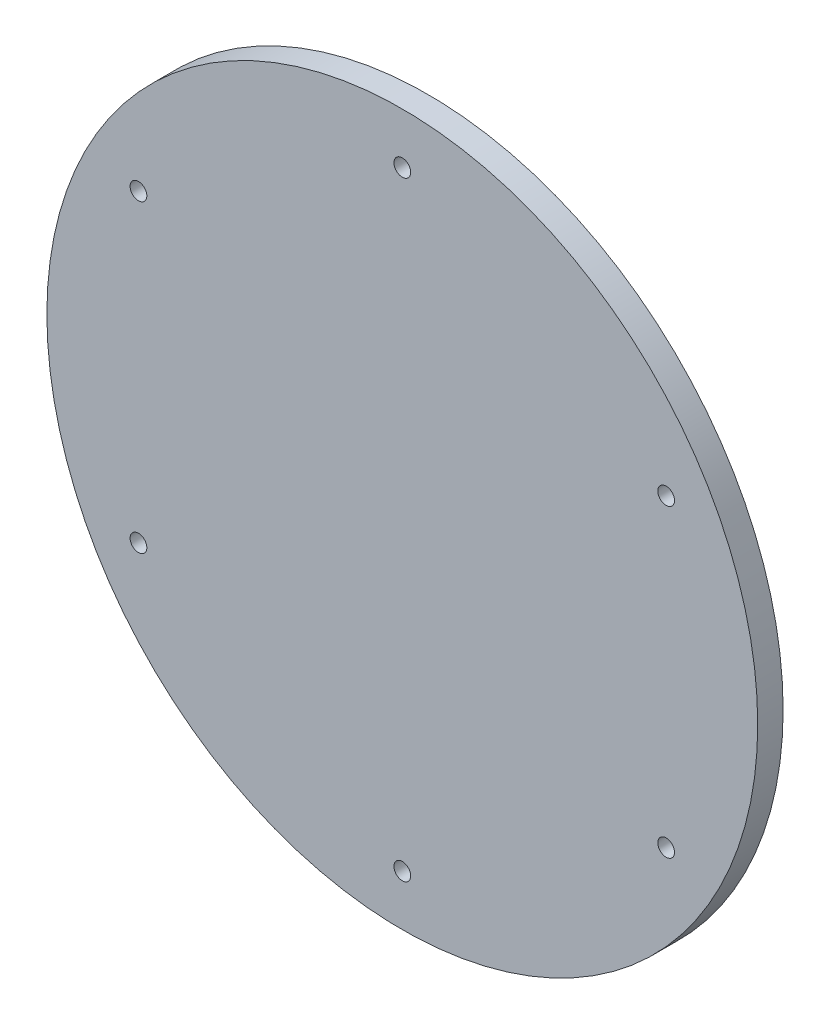
ISO-10303-21;
HEADER;
FILE_DESCRIPTION(('STEP AP214'),'2;1');
FILE_NAME('part.step','',(''),(''),'','','');
FILE_SCHEMA(('AUTOMOTIVE_DESIGN { 1 0 10303 214 1 1 1 1 }'));
ENDSEC;
DATA;
#1=APPLICATION_CONTEXT('core data for automotive mechanical design processes');
#2=APPLICATION_PROTOCOL_DEFINITION('international standard','automotive_design',2000,#1);
#3=PRODUCT_CONTEXT('',#1,'mechanical');
#4=PRODUCT('Part','Part','',(#3));
#5=PRODUCT_RELATED_PRODUCT_CATEGORY('part','',(#4));
#6=PRODUCT_DEFINITION_FORMATION('','',#4);
#7=PRODUCT_DEFINITION_CONTEXT('part definition',#1,'design');
#8=PRODUCT_DEFINITION('design','',#6,#7);
#9=PRODUCT_DEFINITION_SHAPE('','',#8);
#10=(LENGTH_UNIT() NAMED_UNIT(*) SI_UNIT(.MILLI.,.METRE.));
#11=(NAMED_UNIT(*) PLANE_ANGLE_UNIT() SI_UNIT($,.RADIAN.));
#12=(NAMED_UNIT(*) SI_UNIT($,.STERADIAN.) SOLID_ANGLE_UNIT());
#13=UNCERTAINTY_MEASURE_WITH_UNIT(LENGTH_MEASURE(1.E-05),#10,'distance_accuracy_value','');
#14=(GEOMETRIC_REPRESENTATION_CONTEXT(3) GLOBAL_UNCERTAINTY_ASSIGNED_CONTEXT((#13)) GLOBAL_UNIT_ASSIGNED_CONTEXT((#10,
#11,#12)) REPRESENTATION_CONTEXT('',''));
#15=CARTESIAN_POINT('',(0.,0.,0.));
#16=DIRECTION('',(0.,0.,1.));
#17=DIRECTION('',(1.,0.,0.));
#18=AXIS2_PLACEMENT_3D('',#15,#16,#17);
#19=CARTESIAN_POINT('',(0.,0.,5.));
#20=DIRECTION('',(0.,0.,1.));
#21=DIRECTION('',(1.,0.,0.));
#22=AXIS2_PLACEMENT_3D('',#19,#20,#21);
#23=PLANE('',#22);
#24=CARTESIAN_POINT('',(-51.9615242270663,-30.,5.));
#25=DIRECTION('',(0.,0.,1.));
#26=DIRECTION('',(1.,0.,0.));
#27=AXIS2_PLACEMENT_3D('',#24,#25,#26);
#28=CIRCLE('',#27,1.65);
#29=CARTESIAN_POINT('',(-50.3115242270663,-30.,5.));
#30=VERTEX_POINT('',#29);
#31=EDGE_CURVE('E65',#30,#30,#28,.T.);
#32=ORIENTED_EDGE('',*,*,#31,.F.);
#33=EDGE_LOOP('',(#32));
#34=FACE_BOUND('',#33,.T.);
#35=CARTESIAN_POINT('',(51.9615242270663,-30.,5.));
#36=DIRECTION('',(0.,0.,1.));
#37=DIRECTION('',(1.,0.,0.));
#38=AXIS2_PLACEMENT_3D('',#35,#36,#37);
#39=CIRCLE('',#38,1.65000000000015);
#40=CARTESIAN_POINT('',(53.6115242270665,-30.,5.));
#41=VERTEX_POINT('',#40);
#42=EDGE_CURVE('E53',#41,#41,#39,.T.);
#43=ORIENTED_EDGE('',*,*,#42,.F.);
#44=EDGE_LOOP('',(#43));
#45=FACE_BOUND('',#44,.T.);
#46=CARTESIAN_POINT('',(0.,60.,5.));
#47=DIRECTION('',(0.,0.,1.));
#48=DIRECTION('',(1.,0.,0.));
#49=AXIS2_PLACEMENT_3D('',#46,#47,#48);
#50=CIRCLE('',#49,1.65);
#51=CARTESIAN_POINT('',(1.65,60.,5.));
#52=VERTEX_POINT('',#51);
#53=EDGE_CURVE('E42',#52,#52,#50,.T.);
#54=ORIENTED_EDGE('',*,*,#53,.F.);
#55=EDGE_LOOP('',(#54));
#56=FACE_BOUND('',#55,.T.);
#57=CARTESIAN_POINT('',(0.,0.,5.));
#58=DIRECTION('',(0.,0.,1.));
#59=DIRECTION('',(1.,0.,0.));
#60=AXIS2_PLACEMENT_3D('',#57,#58,#59);
#61=CIRCLE('',#60,70.);
#62=CARTESIAN_POINT('',(70.,0.,5.));
#63=VERTEX_POINT('',#62);
#64=EDGE_CURVE('E10',#63,#63,#61,.T.);
#65=ORIENTED_EDGE('',*,*,#64,.T.);
#66=EDGE_LOOP('',(#65));
#67=FACE_BOUND('',#66,.T.);
#68=CARTESIAN_POINT('',(51.9615242270663,30.,5.));
#69=DIRECTION('',(0.,0.,1.));
#70=DIRECTION('',(1.,0.,0.));
#71=AXIS2_PLACEMENT_3D('',#68,#69,#70);
#72=CIRCLE('',#71,1.65000000000008);
#73=CARTESIAN_POINT('',(53.6115242270664,30.,5.));
#74=VERTEX_POINT('',#73);
#75=EDGE_CURVE('E47',#74,#74,#72,.T.);
#76=ORIENTED_EDGE('',*,*,#75,.F.);
#77=EDGE_LOOP('',(#76));
#78=FACE_BOUND('',#77,.T.);
#79=CARTESIAN_POINT('',(0.,-60.,5.));
#80=DIRECTION('',(0.,0.,1.));
#81=DIRECTION('',(1.,0.,0.));
#82=AXIS2_PLACEMENT_3D('',#79,#80,#81);
#83=CIRCLE('',#82,1.65);
#84=CARTESIAN_POINT('',(1.65000000000001,-60.,5.));
#85=VERTEX_POINT('',#84);
#86=EDGE_CURVE('E59',#85,#85,#83,.T.);
#87=ORIENTED_EDGE('',*,*,#86,.F.);
#88=EDGE_LOOP('',(#87));
#89=FACE_BOUND('',#88,.T.);
#90=CARTESIAN_POINT('',(-51.9615242270663,30.,5.));
#91=DIRECTION('',(0.,0.,1.));
#92=DIRECTION('',(1.,0.,0.));
#93=AXIS2_PLACEMENT_3D('',#90,#91,#92);
#94=CIRCLE('',#93,1.65);
#95=CARTESIAN_POINT('',(-50.3115242270664,30.,5.));
#96=VERTEX_POINT('',#95);
#97=EDGE_CURVE('E71',#96,#96,#94,.T.);
#98=ORIENTED_EDGE('',*,*,#97,.F.);
#99=EDGE_LOOP('',(#98));
#100=FACE_BOUND('',#99,.T.);
#101=ADVANCED_FACE('F31',(#34,#45,#56,#67,#78,#89,#100),#23,.T.);
#102=CARTESIAN_POINT('',(0.,0.,0.));
#103=DIRECTION('',(0.,0.,1.));
#104=DIRECTION('',(1.,0.,0.));
#105=AXIS2_PLACEMENT_3D('',#102,#103,#104);
#106=PLANE('',#105);
#107=CARTESIAN_POINT('',(0.,0.,0.));
#108=DIRECTION('',(0.,0.,1.));
#109=DIRECTION('',(1.,0.,0.));
#110=AXIS2_PLACEMENT_3D('',#107,#108,#109);
#111=CIRCLE('',#110,70.);
#112=CARTESIAN_POINT('',(70.,0.,0.));
#113=VERTEX_POINT('',#112);
#114=EDGE_CURVE('E35',#113,#113,#111,.T.);
#115=ORIENTED_EDGE('',*,*,#114,.F.);
#116=EDGE_LOOP('',(#115));
#117=FACE_BOUND('',#116,.T.);
#118=CARTESIAN_POINT('',(0.,60.,0.));
#119=DIRECTION('',(0.,0.,1.));
#120=DIRECTION('',(1.,0.,0.));
#121=AXIS2_PLACEMENT_3D('',#118,#119,#120);
#122=CIRCLE('',#121,1.65);
#123=CARTESIAN_POINT('',(1.65,60.,0.));
#124=VERTEX_POINT('',#123);
#125=EDGE_CURVE('E44',#124,#124,#122,.T.);
#126=ORIENTED_EDGE('',*,*,#125,.T.);
#127=EDGE_LOOP('',(#126));
#128=FACE_BOUND('',#127,.T.);
#129=CARTESIAN_POINT('',(51.9615242270663,30.,0.));
#130=DIRECTION('',(0.,0.,1.));
#131=DIRECTION('',(1.,0.,0.));
#132=AXIS2_PLACEMENT_3D('',#129,#130,#131);
#133=CIRCLE('',#132,1.65000000000008);
#134=CARTESIAN_POINT('',(53.6115242270664,30.,0.));
#135=VERTEX_POINT('',#134);
#136=EDGE_CURVE('E50',#135,#135,#133,.T.);
#137=ORIENTED_EDGE('',*,*,#136,.T.);
#138=EDGE_LOOP('',(#137));
#139=FACE_BOUND('',#138,.T.);
#140=CARTESIAN_POINT('',(51.9615242270663,-30.,0.));
#141=DIRECTION('',(0.,0.,1.));
#142=DIRECTION('',(1.,0.,0.));
#143=AXIS2_PLACEMENT_3D('',#140,#141,#142);
#144=CIRCLE('',#143,1.65000000000015);
#145=CARTESIAN_POINT('',(53.6115242270665,-30.,0.));
#146=VERTEX_POINT('',#145);
#147=EDGE_CURVE('E56',#146,#146,#144,.T.);
#148=ORIENTED_EDGE('',*,*,#147,.T.);
#149=EDGE_LOOP('',(#148));
#150=FACE_BOUND('',#149,.T.);
#151=CARTESIAN_POINT('',(0.,-60.,0.));
#152=DIRECTION('',(0.,0.,1.));
#153=DIRECTION('',(1.,0.,0.));
#154=AXIS2_PLACEMENT_3D('',#151,#152,#153);
#155=CIRCLE('',#154,1.65);
#156=CARTESIAN_POINT('',(1.65000000000001,-60.,0.));
#157=VERTEX_POINT('',#156);
#158=EDGE_CURVE('E62',#157,#157,#155,.T.);
#159=ORIENTED_EDGE('',*,*,#158,.T.);
#160=EDGE_LOOP('',(#159));
#161=FACE_BOUND('',#160,.T.);
#162=CARTESIAN_POINT('',(-51.9615242270663,-30.,0.));
#163=DIRECTION('',(0.,0.,1.));
#164=DIRECTION('',(1.,0.,0.));
#165=AXIS2_PLACEMENT_3D('',#162,#163,#164);
#166=CIRCLE('',#165,1.65);
#167=CARTESIAN_POINT('',(-50.3115242270663,-30.,0.));
#168=VERTEX_POINT('',#167);
#169=EDGE_CURVE('E68',#168,#168,#166,.T.);
#170=ORIENTED_EDGE('',*,*,#169,.T.);
#171=EDGE_LOOP('',(#170));
#172=FACE_BOUND('',#171,.T.);
#173=CARTESIAN_POINT('',(-51.9615242270663,30.,0.));
#174=DIRECTION('',(0.,0.,1.));
#175=DIRECTION('',(1.,0.,0.));
#176=AXIS2_PLACEMENT_3D('',#173,#174,#175);
#177=CIRCLE('',#176,1.65);
#178=CARTESIAN_POINT('',(-50.3115242270664,30.,0.));
#179=VERTEX_POINT('',#178);
#180=EDGE_CURVE('E74',#179,#179,#177,.T.);
#181=ORIENTED_EDGE('',*,*,#180,.T.);
#182=EDGE_LOOP('',(#181));
#183=FACE_BOUND('',#182,.T.);
#184=ADVANCED_FACE('F84',(#117,#128,#139,#150,#161,#172,#183),#106,.F.);
#185=CARTESIAN_POINT('',(0.,0.,5.));
#186=DIRECTION('',(0.,0.,-1.));
#187=DIRECTION('',(-1.,0.,0.));
#188=AXIS2_PLACEMENT_3D('',#185,#186,#187);
#189=CYLINDRICAL_SURFACE('',#188,70.);
#190=ORIENTED_EDGE('',*,*,#64,.F.);
#191=EDGE_LOOP('',(#190));
#192=FACE_BOUND('',#191,.T.);
#193=ORIENTED_EDGE('',*,*,#114,.T.);
#194=EDGE_LOOP('',(#193));
#195=FACE_BOUND('',#194,.T.);
#196=ADVANCED_FACE('F33',(#192,#195),#189,.T.);
#197=CARTESIAN_POINT('',(0.,60.,5.));
#198=DIRECTION('',(0.,0.,-1.));
#199=DIRECTION('',(-1.,0.,0.));
#200=AXIS2_PLACEMENT_3D('',#197,#198,#199);
#201=CYLINDRICAL_SURFACE('',#200,1.65);
#202=ORIENTED_EDGE('',*,*,#53,.T.);
#203=EDGE_LOOP('',(#202));
#204=FACE_BOUND('',#203,.T.);
#205=ORIENTED_EDGE('',*,*,#125,.F.);
#206=EDGE_LOOP('',(#205));
#207=FACE_BOUND('',#206,.T.);
#208=ADVANCED_FACE('F94',(#204,#207),#201,.F.);
#209=CARTESIAN_POINT('',(51.9615242270663,30.,5.));
#210=DIRECTION('',(0.,0.,-1.));
#211=DIRECTION('',(-1.,0.,0.));
#212=AXIS2_PLACEMENT_3D('',#209,#210,#211);
#213=CYLINDRICAL_SURFACE('',#212,1.65000000000008);
#214=ORIENTED_EDGE('',*,*,#75,.T.);
#215=EDGE_LOOP('',(#214));
#216=FACE_BOUND('',#215,.T.);
#217=ORIENTED_EDGE('',*,*,#136,.F.);
#218=EDGE_LOOP('',(#217));
#219=FACE_BOUND('',#218,.T.);
#220=ADVANCED_FACE('F97',(#216,#219),#213,.F.);
#221=CARTESIAN_POINT('',(51.9615242270663,-30.,5.));
#222=DIRECTION('',(0.,0.,-1.));
#223=DIRECTION('',(-1.,0.,0.));
#224=AXIS2_PLACEMENT_3D('',#221,#222,#223);
#225=CYLINDRICAL_SURFACE('',#224,1.65000000000015);
#226=ORIENTED_EDGE('',*,*,#42,.T.);
#227=EDGE_LOOP('',(#226));
#228=FACE_BOUND('',#227,.T.);
#229=ORIENTED_EDGE('',*,*,#147,.F.);
#230=EDGE_LOOP('',(#229));
#231=FACE_BOUND('',#230,.T.);
#232=ADVANCED_FACE('F101',(#228,#231),#225,.F.);
#233=CARTESIAN_POINT('',(0.,-60.,5.));
#234=DIRECTION('',(0.,0.,-1.));
#235=DIRECTION('',(-1.,0.,0.));
#236=AXIS2_PLACEMENT_3D('',#233,#234,#235);
#237=CYLINDRICAL_SURFACE('',#236,1.65);
#238=ORIENTED_EDGE('',*,*,#86,.T.);
#239=EDGE_LOOP('',(#238));
#240=FACE_BOUND('',#239,.T.);
#241=ORIENTED_EDGE('',*,*,#158,.F.);
#242=EDGE_LOOP('',(#241));
#243=FACE_BOUND('',#242,.T.);
#244=ADVANCED_FACE('F105',(#240,#243),#237,.F.);
#245=CARTESIAN_POINT('',(-51.9615242270663,-30.,5.));
#246=DIRECTION('',(0.,0.,-1.));
#247=DIRECTION('',(-1.,0.,0.));
#248=AXIS2_PLACEMENT_3D('',#245,#246,#247);
#249=CYLINDRICAL_SURFACE('',#248,1.65);
#250=ORIENTED_EDGE('',*,*,#31,.T.);
#251=EDGE_LOOP('',(#250));
#252=FACE_BOUND('',#251,.T.);
#253=ORIENTED_EDGE('',*,*,#169,.F.);
#254=EDGE_LOOP('',(#253));
#255=FACE_BOUND('',#254,.T.);
#256=ADVANCED_FACE('F109',(#252,#255),#249,.F.);
#257=CARTESIAN_POINT('',(-51.9615242270663,30.,5.));
#258=DIRECTION('',(0.,0.,-1.));
#259=DIRECTION('',(-1.,0.,0.));
#260=AXIS2_PLACEMENT_3D('',#257,#258,#259);
#261=CYLINDRICAL_SURFACE('',#260,1.65);
#262=ORIENTED_EDGE('',*,*,#97,.T.);
#263=EDGE_LOOP('',(#262));
#264=FACE_BOUND('',#263,.T.);
#265=ORIENTED_EDGE('',*,*,#180,.F.);
#266=EDGE_LOOP('',(#265));
#267=FACE_BOUND('',#266,.T.);
#268=ADVANCED_FACE('F80',(#264,#267),#261,.F.);
#269=CLOSED_SHELL('',(#101,#184,#196,#208,#220,#232,#244,#256,#268));
#270=MANIFOLD_SOLID_BREP('B2',#269);
#271=ADVANCED_BREP_SHAPE_REPRESENTATION('',(#18,#270),#14);
#272=SHAPE_DEFINITION_REPRESENTATION(#9,#271);
ENDSEC;
END-ISO-10303-21;
